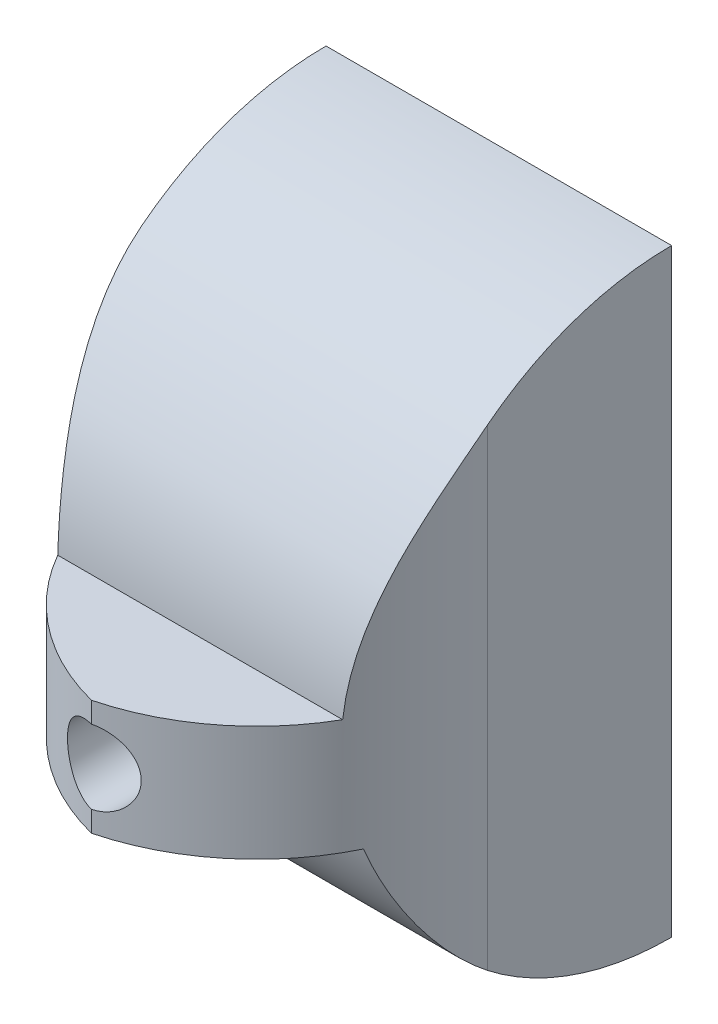
ISO-10303-21;
HEADER;
FILE_DESCRIPTION(('STEP AP214'),'2;1');
FILE_NAME('part.step','',(''),(''),'','','');
FILE_SCHEMA(('AUTOMOTIVE_DESIGN { 1 0 10303 214 1 1 1 1 }'));
ENDSEC;
DATA;
#1=APPLICATION_CONTEXT('core data for automotive mechanical design processes');
#2=APPLICATION_PROTOCOL_DEFINITION('international standard','automotive_design',2000,#1);
#3=PRODUCT_CONTEXT('',#1,'mechanical');
#4=PRODUCT('Part','Part','',(#3));
#5=PRODUCT_RELATED_PRODUCT_CATEGORY('part','',(#4));
#6=PRODUCT_DEFINITION_FORMATION('','',#4);
#7=PRODUCT_DEFINITION_CONTEXT('part definition',#1,'design');
#8=PRODUCT_DEFINITION('design','',#6,#7);
#9=PRODUCT_DEFINITION_SHAPE('','',#8);
#10=(LENGTH_UNIT() NAMED_UNIT(*) SI_UNIT(.MILLI.,.METRE.));
#11=(NAMED_UNIT(*) PLANE_ANGLE_UNIT() SI_UNIT($,.RADIAN.));
#12=(NAMED_UNIT(*) SI_UNIT($,.STERADIAN.) SOLID_ANGLE_UNIT());
#13=UNCERTAINTY_MEASURE_WITH_UNIT(LENGTH_MEASURE(1.E-05),#10,'distance_accuracy_value','');
#14=(GEOMETRIC_REPRESENTATION_CONTEXT(3) GLOBAL_UNCERTAINTY_ASSIGNED_CONTEXT((#13)) GLOBAL_UNIT_ASSIGNED_CONTEXT((#10,
#11,#12)) REPRESENTATION_CONTEXT('',''));
#15=CARTESIAN_POINT('',(0.,0.,0.));
#16=DIRECTION('',(0.,0.,1.));
#17=DIRECTION('',(1.,0.,0.));
#18=AXIS2_PLACEMENT_3D('',#15,#16,#17);
#19=CARTESIAN_POINT('',(0.,0.,18.));
#20=DIRECTION('',(1.,0.,0.));
#21=DIRECTION('',(0.,1.,0.));
#22=AXIS2_PLACEMENT_3D('',#19,#20,#21);
#23=PLANE('',#22);
#24=CARTESIAN_POINT('',(0.,13.,0.));
#25=DIRECTION('',(1.,0.,0.));
#26=DIRECTION('',(0.,1.,0.));
#27=AXIS2_PLACEMENT_3D('',#24,#25,#26);
#28=CIRCLE('',#27,13.);
#29=CARTESIAN_POINT('',(0.,0.,0.));
#30=VERTEX_POINT('',#29);
#31=CARTESIAN_POINT('',(0.,2.7530492340404,8.));
#32=VERTEX_POINT('',#31);
#33=EDGE_CURVE('E217',#30,#32,#28,.F.);
#34=ORIENTED_EDGE('',*,*,#33,.T.);
#35=DIRECTION('',(0.,-1.,0.));
#36=VECTOR('',#35,1.);
#37=CARTESIAN_POINT('',(0.,0.,8.));
#38=LINE('',#37,#36);
#39=CARTESIAN_POINT('',(0.,23.2469507659596,8.));
#40=VERTEX_POINT('',#39);
#41=EDGE_CURVE('E48',#32,#40,#38,.F.);
#42=ORIENTED_EDGE('',*,*,#41,.T.);
#43=CARTESIAN_POINT('',(0.,13.,0.));
#44=DIRECTION('',(1.,0.,0.));
#45=DIRECTION('',(0.,1.,0.));
#46=AXIS2_PLACEMENT_3D('',#43,#44,#45);
#47=CIRCLE('',#46,13.);
#48=CARTESIAN_POINT('',(0.,26.,0.));
#49=VERTEX_POINT('',#48);
#50=EDGE_CURVE('E154',#40,#49,#47,.F.);
#51=ORIENTED_EDGE('',*,*,#50,.T.);
#52=DIRECTION('',(0.,-1.,0.));
#53=VECTOR('',#52,1.);
#54=CARTESIAN_POINT('',(0.,0.,0.));
#55=LINE('',#54,#53);
#56=EDGE_CURVE('E242',#49,#30,#55,.T.);
#57=ORIENTED_EDGE('',*,*,#56,.T.);
#58=EDGE_LOOP('',(#34,#42,#51,#57));
#59=FACE_BOUND('',#58,.T.);
#60=ADVANCED_FACE('F35',(#59),#23,.F.);
#61=CARTESIAN_POINT('',(15.,0.,18.));
#62=DIRECTION('',(-1.,0.,0.));
#63=DIRECTION('',(0.,-1.,0.));
#64=AXIS2_PLACEMENT_3D('',#61,#62,#63);
#65=PLANE('',#64);
#66=CARTESIAN_POINT('',(15.,13.,0.));
#67=DIRECTION('',(1.,0.,0.));
#68=DIRECTION('',(0.,1.,0.));
#69=AXIS2_PLACEMENT_3D('',#66,#67,#68);
#70=CIRCLE('',#69,13.);
#71=CARTESIAN_POINT('',(15.,26.,0.));
#72=VERTEX_POINT('',#71);
#73=CARTESIAN_POINT('',(15.,23.2469507659596,8.));
#74=VERTEX_POINT('',#73);
#75=EDGE_CURVE('E214',#72,#74,#70,.T.);
#76=ORIENTED_EDGE('',*,*,#75,.T.);
#77=DIRECTION('',(0.,1.,0.));
#78=VECTOR('',#77,1.);
#79=CARTESIAN_POINT('',(15.,0.,8.));
#80=LINE('',#79,#78);
#81=CARTESIAN_POINT('',(15.,2.7530492340404,8.));
#82=VERTEX_POINT('',#81);
#83=EDGE_CURVE('E189',#74,#82,#80,.F.);
#84=ORIENTED_EDGE('',*,*,#83,.T.);
#85=CARTESIAN_POINT('',(15.,13.,0.));
#86=DIRECTION('',(1.,0.,0.));
#87=DIRECTION('',(0.,1.,0.));
#88=AXIS2_PLACEMENT_3D('',#85,#86,#87);
#89=CIRCLE('',#88,13.);
#90=CARTESIAN_POINT('',(15.,0.,0.));
#91=VERTEX_POINT('',#90);
#92=EDGE_CURVE('E221',#82,#91,#89,.T.);
#93=ORIENTED_EDGE('',*,*,#92,.T.);
#94=DIRECTION('',(0.,1.,0.));
#95=VECTOR('',#94,1.);
#96=CARTESIAN_POINT('',(15.,0.,0.));
#97=LINE('',#96,#95);
#98=EDGE_CURVE('E251',#91,#72,#97,.T.);
#99=ORIENTED_EDGE('',*,*,#98,.T.);
#100=EDGE_LOOP('',(#76,#84,#93,#99));
#101=FACE_BOUND('',#100,.T.);
#102=ADVANCED_FACE('F297',(#101),#65,.F.);
#103=CARTESIAN_POINT('',(0.,26.,0.));
#104=DIRECTION('',(0.,0.,-1.));
#105=DIRECTION('',(-1.,0.,0.));
#106=AXIS2_PLACEMENT_3D('',#103,#104,#105);
#107=PLANE('',#106);
#108=ORIENTED_EDGE('',*,*,#56,.F.);
#109=DIRECTION('',(-1.,0.,0.));
#110=VECTOR('',#109,1.);
#111=CARTESIAN_POINT('',(0.,26.,0.));
#112=LINE('',#111,#110);
#113=EDGE_CURVE('E254',#72,#49,#112,.T.);
#114=ORIENTED_EDGE('',*,*,#113,.F.);
#115=ORIENTED_EDGE('',*,*,#98,.F.);
#116=DIRECTION('',(1.,0.,0.));
#117=VECTOR('',#116,1.);
#118=CARTESIAN_POINT('',(0.,0.,0.));
#119=LINE('',#118,#117);
#120=EDGE_CURVE('E248',#30,#91,#119,.T.);
#121=ORIENTED_EDGE('',*,*,#120,.F.);
#122=EDGE_LOOP('',(#108,#114,#115,#121));
#123=FACE_BOUND('',#122,.T.);
#124=DIRECTION('',(1.,0.,0.));
#125=VECTOR('',#124,1.);
#126=CARTESIAN_POINT('',(3.,25.,0.));
#127=LINE('',#126,#125);
#128=CARTESIAN_POINT('',(3.,25.,0.));
#129=VERTEX_POINT('',#128);
#130=CARTESIAN_POINT('',(12.,25.,0.));
#131=VERTEX_POINT('',#130);
#132=EDGE_CURVE('E277',#129,#131,#127,.T.);
#133=ORIENTED_EDGE('',*,*,#132,.F.);
#134=DIRECTION('',(0.,-1.,0.));
#135=VECTOR('',#134,1.);
#136=CARTESIAN_POINT('',(3.,26.,0.));
#137=LINE('',#136,#135);
#138=CARTESIAN_POINT('',(3.,17.,0.));
#139=VERTEX_POINT('',#138);
#140=EDGE_CURVE('E238',#129,#139,#137,.T.);
#141=ORIENTED_EDGE('',*,*,#140,.T.);
#142=DIRECTION('',(1.,0.,0.));
#143=VECTOR('',#142,1.);
#144=CARTESIAN_POINT('',(2.,17.,0.));
#145=LINE('',#144,#143);
#146=CARTESIAN_POINT('',(2.,17.,0.));
#147=VERTEX_POINT('',#146);
#148=EDGE_CURVE('E264',#147,#139,#145,.T.);
#149=ORIENTED_EDGE('',*,*,#148,.F.);
#150=DIRECTION('',(0.,-1.,0.));
#151=VECTOR('',#150,1.);
#152=CARTESIAN_POINT('',(1.99999999999999,26.,0.));
#153=LINE('',#152,#151);
#154=CARTESIAN_POINT('',(2.,9.00000000000001,0.));
#155=VERTEX_POINT('',#154);
#156=EDGE_CURVE('E267',#147,#155,#153,.T.);
#157=ORIENTED_EDGE('',*,*,#156,.T.);
#158=DIRECTION('',(1.,0.,0.));
#159=VECTOR('',#158,1.);
#160=CARTESIAN_POINT('',(2.,9.00000000000001,0.));
#161=LINE('',#160,#159);
#162=CARTESIAN_POINT('',(3.00000000000001,9.00000000000001,0.));
#163=VERTEX_POINT('',#162);
#164=EDGE_CURVE('E259',#163,#155,#161,.F.);
#165=ORIENTED_EDGE('',*,*,#164,.F.);
#166=CARTESIAN_POINT('',(3.00000000000001,0.99999999999999,0.));
#167=VERTEX_POINT('',#166);
#168=EDGE_CURVE('E235',#163,#167,#137,.T.);
#169=ORIENTED_EDGE('',*,*,#168,.T.);
#170=DIRECTION('',(1.,0.,0.));
#171=VECTOR('',#170,1.);
#172=CARTESIAN_POINT('',(3.00000000000001,0.99999999999999,0.));
#173=LINE('',#172,#171);
#174=CARTESIAN_POINT('',(12.,0.999999999999992,0.));
#175=VERTEX_POINT('',#174);
#176=EDGE_CURVE('E275',#175,#167,#173,.F.);
#177=ORIENTED_EDGE('',*,*,#176,.F.);
#178=DIRECTION('',(0.,-1.,0.));
#179=VECTOR('',#178,1.);
#180=CARTESIAN_POINT('',(12.,26.,0.));
#181=LINE('',#180,#179);
#182=CARTESIAN_POINT('',(12.,9.00000000000001,0.));
#183=VERTEX_POINT('',#182);
#184=EDGE_CURVE('E230',#183,#175,#181,.T.);
#185=ORIENTED_EDGE('',*,*,#184,.F.);
#186=CARTESIAN_POINT('',(13.,9.00000000000001,0.));
#187=VERTEX_POINT('',#186);
#188=EDGE_CURVE('E260',#187,#183,#161,.F.);
#189=ORIENTED_EDGE('',*,*,#188,.F.);
#190=DIRECTION('',(0.,-1.,0.));
#191=VECTOR('',#190,1.);
#192=CARTESIAN_POINT('',(13.,26.,0.));
#193=LINE('',#192,#191);
#194=CARTESIAN_POINT('',(13.,17.,0.));
#195=VERTEX_POINT('',#194);
#196=EDGE_CURVE('E257',#195,#187,#193,.T.);
#197=ORIENTED_EDGE('',*,*,#196,.F.);
#198=CARTESIAN_POINT('',(12.,17.,0.));
#199=VERTEX_POINT('',#198);
#200=EDGE_CURVE('E263',#199,#195,#145,.T.);
#201=ORIENTED_EDGE('',*,*,#200,.F.);
#202=EDGE_CURVE('E234',#131,#199,#181,.T.);
#203=ORIENTED_EDGE('',*,*,#202,.F.);
#204=EDGE_LOOP('',(#133,#141,#149,#157,#165,#169,#177,#185,#189,#197,#201,#203));
#205=FACE_BOUND('',#204,.T.);
#206=ADVANCED_FACE('F293',(#123,#205),#107,.T.);
#207=CARTESIAN_POINT('',(2.,13.,0.));
#208=DIRECTION('',(1.,0.,0.));
#209=DIRECTION('',(0.,1.,0.));
#210=AXIS2_PLACEMENT_3D('',#207,#208,#209);
#211=CYLINDRICAL_SURFACE('',#210,4.);
#212=CARTESIAN_POINT('',(3.,13.,0.));
#213=DIRECTION('',(1.,0.,0.));
#214=DIRECTION('',(0.,1.,0.));
#215=AXIS2_PLACEMENT_3D('',#212,#213,#214);
#216=CIRCLE('',#215,4.);
#217=EDGE_CURVE('E273',#163,#139,#216,.F.);
#218=ORIENTED_EDGE('',*,*,#217,.F.);
#219=ORIENTED_EDGE('',*,*,#164,.T.);
#220=CARTESIAN_POINT('',(2.,13.,0.));
#221=DIRECTION('',(1.,0.,0.));
#222=DIRECTION('',(0.,1.,0.));
#223=AXIS2_PLACEMENT_3D('',#220,#221,#222);
#224=CIRCLE('',#223,4.);
#225=EDGE_CURVE('E239',#147,#155,#224,.T.);
#226=ORIENTED_EDGE('',*,*,#225,.F.);
#227=ORIENTED_EDGE('',*,*,#148,.T.);
#228=EDGE_LOOP('',(#218,#219,#226,#227));
#229=FACE_BOUND('',#228,.T.);
#230=ADVANCED_FACE('F319',(#229),#211,.F.);
#231=ORIENTED_EDGE('',*,*,#188,.T.);
#232=CARTESIAN_POINT('',(12.,13.,0.));
#233=DIRECTION('',(1.,0.,0.));
#234=DIRECTION('',(0.,1.,0.));
#235=AXIS2_PLACEMENT_3D('',#232,#233,#234);
#236=CIRCLE('',#235,4.);
#237=EDGE_CURVE('E270',#183,#199,#236,.F.);
#238=ORIENTED_EDGE('',*,*,#237,.T.);
#239=ORIENTED_EDGE('',*,*,#200,.T.);
#240=CARTESIAN_POINT('',(13.,13.,0.));
#241=DIRECTION('',(1.,0.,0.));
#242=DIRECTION('',(0.,1.,0.));
#243=AXIS2_PLACEMENT_3D('',#240,#241,#242);
#244=CIRCLE('',#243,4.);
#245=EDGE_CURVE('E243',#195,#187,#244,.T.);
#246=ORIENTED_EDGE('',*,*,#245,.T.);
#247=EDGE_LOOP('',(#231,#238,#239,#246));
#248=FACE_BOUND('',#247,.T.);
#249=ADVANCED_FACE('F322',(#248),#211,.F.);
#250=CARTESIAN_POINT('',(2.,13.,0.));
#251=DIRECTION('',(1.,0.,0.));
#252=DIRECTION('',(0.,1.,0.));
#253=AXIS2_PLACEMENT_3D('',#250,#251,#252);
#254=PLANE('',#253);
#255=ORIENTED_EDGE('',*,*,#225,.T.);
#256=ORIENTED_EDGE('',*,*,#156,.F.);
#257=EDGE_LOOP('',(#255,#256));
#258=FACE_BOUND('',#257,.T.);
#259=ADVANCED_FACE('F325',(#258),#254,.T.);
#260=CARTESIAN_POINT('',(13.,13.,0.));
#261=DIRECTION('',(1.,0.,0.));
#262=DIRECTION('',(0.,1.,0.));
#263=AXIS2_PLACEMENT_3D('',#260,#261,#262);
#264=PLANE('',#263);
#265=ORIENTED_EDGE('',*,*,#196,.T.);
#266=ORIENTED_EDGE('',*,*,#245,.F.);
#267=EDGE_LOOP('',(#265,#266));
#268=FACE_BOUND('',#267,.T.);
#269=ADVANCED_FACE('F327',(#268),#264,.F.);
#270=CARTESIAN_POINT('',(3.,13.,0.));
#271=DIRECTION('',(1.,0.,0.));
#272=DIRECTION('',(0.,1.,0.));
#273=AXIS2_PLACEMENT_3D('',#270,#271,#272);
#274=CYLINDRICAL_SURFACE('',#273,12.);
#275=ORIENTED_EDGE('',*,*,#132,.T.);
#276=CARTESIAN_POINT('',(12.,13.,0.));
#277=DIRECTION('',(1.,0.,0.));
#278=DIRECTION('',(0.,1.,0.));
#279=AXIS2_PLACEMENT_3D('',#276,#277,#278);
#280=CIRCLE('',#279,12.);
#281=EDGE_CURVE('E226',#131,#175,#280,.T.);
#282=ORIENTED_EDGE('',*,*,#281,.T.);
#283=ORIENTED_EDGE('',*,*,#176,.T.);
#284=CARTESIAN_POINT('',(3.,13.,0.));
#285=DIRECTION('',(1.,0.,0.));
#286=DIRECTION('',(0.,1.,0.));
#287=AXIS2_PLACEMENT_3D('',#284,#285,#286);
#288=CIRCLE('',#287,12.);
#289=EDGE_CURVE('E227',#129,#167,#288,.T.);
#290=ORIENTED_EDGE('',*,*,#289,.F.);
#291=EDGE_LOOP('',(#275,#282,#283,#290));
#292=FACE_BOUND('',#291,.T.);
#293=ADVANCED_FACE('F330',(#292),#274,.F.);
#294=CARTESIAN_POINT('',(3.,13.,0.));
#295=DIRECTION('',(1.,0.,0.));
#296=DIRECTION('',(0.,1.,0.));
#297=AXIS2_PLACEMENT_3D('',#294,#295,#296);
#298=PLANE('',#297);
#299=ORIENTED_EDGE('',*,*,#289,.T.);
#300=ORIENTED_EDGE('',*,*,#168,.F.);
#301=ORIENTED_EDGE('',*,*,#217,.T.);
#302=ORIENTED_EDGE('',*,*,#140,.F.);
#303=EDGE_LOOP('',(#299,#300,#301,#302));
#304=FACE_BOUND('',#303,.T.);
#305=ADVANCED_FACE('F308',(#304),#298,.T.);
#306=CARTESIAN_POINT('',(12.,13.,0.));
#307=DIRECTION('',(1.,0.,0.));
#308=DIRECTION('',(0.,1.,0.));
#309=AXIS2_PLACEMENT_3D('',#306,#307,#308);
#310=PLANE('',#309);
#311=ORIENTED_EDGE('',*,*,#202,.T.);
#312=ORIENTED_EDGE('',*,*,#237,.F.);
#313=ORIENTED_EDGE('',*,*,#184,.T.);
#314=ORIENTED_EDGE('',*,*,#281,.F.);
#315=EDGE_LOOP('',(#311,#312,#313,#314));
#316=FACE_BOUND('',#315,.T.);
#317=ADVANCED_FACE('F303',(#316),#310,.F.);
#318=CARTESIAN_POINT('',(-0.0010000000000062,8.99999999999999,20.4237805730259));
#319=DIRECTION('',(0.,-1.,0.));
#320=DIRECTION('',(0.,0.,-1.));
#321=AXIS2_PLACEMENT_3D('',#318,#319,#320);
#322=PLANE('',#321);
#323=DIRECTION('',(1.,0.,0.));
#324=VECTOR('',#323,1.);
#325=CARTESIAN_POINT('',(-0.0010000000000062,8.99999999999999,12.369316876853));
#326=LINE('',#325,#324);
#327=CARTESIAN_POINT('',(1.00505308355587,8.99999999999999,12.369316876853));
#328=VERTEX_POINT('',#327);
#329=CARTESIAN_POINT('',(13.9949469164441,9.,12.369316876853));
#330=VERTEX_POINT('',#329);
#331=EDGE_CURVE('E223',#328,#330,#326,.T.);
#332=ORIENTED_EDGE('',*,*,#331,.T.);
#333=CARTESIAN_POINT('',(5.,8.99999999999999,8.));
#334=DIRECTION('',(0.,-1.,0.));
#335=DIRECTION('',(0.,0.,-1.));
#336=AXIS2_PLACEMENT_3D('',#333,#334,#335);
#337=CIRCLE('',#336,10.);
#338=CARTESIAN_POINT('',(7.5,8.99999999999999,17.6824583655185));
#339=VERTEX_POINT('',#338);
#340=EDGE_CURVE('E158',#330,#339,#337,.T.);
#341=ORIENTED_EDGE('',*,*,#340,.T.);
#342=CARTESIAN_POINT('',(10.,8.99999999999999,8.));
#343=DIRECTION('',(0.,-1.,0.));
#344=DIRECTION('',(0.,0.,-1.));
#345=AXIS2_PLACEMENT_3D('',#342,#343,#344);
#346=CIRCLE('',#345,10.);
#347=EDGE_CURVE('E160',#339,#328,#346,.T.);
#348=ORIENTED_EDGE('',*,*,#347,.T.);
#349=EDGE_LOOP('',(#332,#341,#348));
#350=FACE_BOUND('',#349,.T.);
#351=ADVANCED_FACE('F301',(#350),#322,.T.);
#352=CARTESIAN_POINT('',(-0.0010000000000062,13.,0.));
#353=DIRECTION('',(1.,0.,0.));
#354=DIRECTION('',(0.,1.,0.));
#355=AXIS2_PLACEMENT_3D('',#352,#353,#354);
#356=CYLINDRICAL_SURFACE('',#355,13.);
#357=ORIENTED_EDGE('',*,*,#92,.F.);
#358=CARTESIAN_POINT('',(15.,2.7530492340404,8.));
#359=CARTESIAN_POINT('',(14.9999998318679,2.85828723149101,8.13479993786347));
#360=CARTESIAN_POINT('',(14.9972742956143,2.96616517687922,8.26748896937473));
#361=CARTESIAN_POINT('',(14.9868845549506,3.18694471827831,8.52837222233529));
#362=CARTESIAN_POINT('',(14.9792214536348,3.29984518697115,8.65656744099738));
#363=CARTESIAN_POINT('',(14.9496234550719,3.64539620536485,9.03368569991535));
#364=CARTESIAN_POINT('',(14.9210765385485,3.88523761596185,9.27557804508672));
#365=CARTESIAN_POINT('',(14.8512742905671,4.37617701712372,9.73343685309302));
#366=CARTESIAN_POINT('',(14.8103305975065,4.62688246675125,9.94987610405439));
#367=CARTESIAN_POINT('',(14.7192557453131,5.14309462914276,10.3623457471823));
#368=CARTESIAN_POINT('',(14.6691216898553,5.4086059895551,10.5583696748736));
#369=CARTESIAN_POINT('',(14.5670602752685,5.93366616058265,10.9160699048367));
#370=CARTESIAN_POINT('',(14.5155115174019,6.19230502783117,11.0791956668982));
#371=CARTESIAN_POINT('',(14.4104717819067,6.7200751559036,11.3866496888696));
#372=CARTESIAN_POINT('',(14.356981165263,6.98920446726928,11.5309814198735));
#373=CARTESIAN_POINT('',(14.2496439805217,7.54320911896365,11.8034246845647));
#374=CARTESIAN_POINT('',(14.1958161322626,7.8283018656222,11.9311020948955));
#375=CARTESIAN_POINT('',(14.0918748630102,8.40759454953236,12.165833004497));
#376=CARTESIAN_POINT('',(14.0417624237492,8.70179686492294,12.272881064686));
#377=CARTESIAN_POINT('',(13.9949469164441,9.,12.369316876853));
#378=B_SPLINE_CURVE_WITH_KNOTS('',3,(#358,#359,#360,#361,#362,#363,#364,#365,#366,#367,#368,
#369,#370,#371,#372,#373,#374,#375,#376,#377),.UNSPECIFIED.,.F.,.F.,(4,2,2,2,2,2,2,2,2,4),(0.,
0.512920092193258,1.02572563337552,2.04968092743253,3.04977554723917,4.05018588848339,
4.97972990289488,5.90910199437499,6.85922525802486,7.80959868703848),.UNSPECIFIED.);
#379=EDGE_CURVE('E162',#82,#330,#378,.T.);
#380=ORIENTED_EDGE('',*,*,#379,.T.);
#381=ORIENTED_EDGE('',*,*,#331,.F.);
#382=CARTESIAN_POINT('',(1.00505308355587,8.99999999999999,12.369316876853));
#383=CARTESIAN_POINT('',(0.973002361048377,8.79592835208449,12.3033207883699));
#384=CARTESIAN_POINT('',(0.939425434955882,8.59375056735331,12.2323648268533));
#385=CARTESIAN_POINT('',(0.87010948323206,8.1934825391262,12.080695987496));
#386=CARTESIAN_POINT('',(0.834370623114919,7.99539198427179,11.9999838561009));
#387=CARTESIAN_POINT('',(0.725187130790062,7.4073772446962,11.743320139932));
#388=CARTESIAN_POINT('',(0.649823437077635,7.02399948248389,11.5529350298241));
#389=CARTESIAN_POINT('',(0.50386673674617,6.28904879662145,11.1415891352395));
#390=CARTESIAN_POINT('',(0.43319828412515,5.93685985214206,10.9217513051389));
#391=CARTESIAN_POINT('',(0.301324839021137,5.25418373694802,10.4486677391429));
#392=CARTESIAN_POINT('',(0.240111938623224,4.92367856610938,10.1954502516291));
#393=CARTESIAN_POINT('',(0.131441282435276,4.26903170760612,9.64177554700368));
#394=CARTESIAN_POINT('',(0.0849411084587857,3.94627302073336,9.33947128857278));
#395=CARTESIAN_POINT('',(0.0356184164567385,3.48309815169858,8.85885151051845));
#396=CARTESIAN_POINT('',(0.0225617936330998,3.33105078690566,8.69265030317337));
#397=CARTESIAN_POINT('',(0.00474990948351053,3.03548507121658,8.35220481090887));
#398=CARTESIAN_POINT('',(6.00176656597688E-07,2.89197290667259,8.17795485089523));
#399=CARTESIAN_POINT('',(0.,2.75304923404039,8.));
#400=B_SPLINE_CURVE_WITH_KNOTS('',3,(#382,#383,#384,#385,#386,#387,#388,#389,#390,#391,#392,
#393,#394,#395,#396,#397,#398,#399),.UNSPECIFIED.,.F.,.F.,(4,2,2,2,2,2,2,2,4),(0.,
0.650420596201151,1.30079146011525,2.60245330152732,3.86400498458459,5.12449582048059,
6.45528835471777,7.13179309696133,7.80878234268855),.UNSPECIFIED.);
#401=EDGE_CURVE('E168',#328,#32,#400,.T.);
#402=ORIENTED_EDGE('',*,*,#401,.T.);
#403=ORIENTED_EDGE('',*,*,#33,.F.);
#404=ORIENTED_EDGE('',*,*,#120,.T.);
#405=EDGE_LOOP('',(#357,#380,#381,#402,#403,#404));
#406=FACE_BOUND('',#405,.T.);
#407=ADVANCED_FACE('F173',(#406),#356,.T.);
#408=CARTESIAN_POINT('',(-0.00100000000000794,14.,20.4237805730259));
#409=DIRECTION('',(0.,1.,0.));
#410=DIRECTION('',(-1.,0.,0.));
#411=AXIS2_PLACEMENT_3D('',#408,#409,#410);
#412=PLANE('',#411);
#413=CARTESIAN_POINT('',(10.,14.,8.));
#414=DIRECTION('',(0.,1.,0.));
#415=DIRECTION('',(-1.,0.,0.));
#416=AXIS2_PLACEMENT_3D('',#413,#414,#415);
#417=CIRCLE('',#416,10.);
#418=CARTESIAN_POINT('',(1.31762115840068,14.,12.9614813968157));
#419=VERTEX_POINT('',#418);
#420=CARTESIAN_POINT('',(7.5,14.,17.6824583655185));
#421=VERTEX_POINT('',#420);
#422=EDGE_CURVE('E279',#419,#421,#417,.T.);
#423=ORIENTED_EDGE('',*,*,#422,.T.);
#424=CARTESIAN_POINT('',(5.,14.,8.));
#425=DIRECTION('',(0.,1.,0.));
#426=DIRECTION('',(-1.,0.,0.));
#427=AXIS2_PLACEMENT_3D('',#424,#425,#426);
#428=CIRCLE('',#427,10.);
#429=CARTESIAN_POINT('',(13.6823788415993,14.,12.9614813968157));
#430=VERTEX_POINT('',#429);
#431=EDGE_CURVE('E151',#421,#430,#428,.T.);
#432=ORIENTED_EDGE('',*,*,#431,.T.);
#433=DIRECTION('',(1.,0.,0.));
#434=VECTOR('',#433,1.);
#435=CARTESIAN_POINT('',(-0.00100000000000794,14.,12.9614813968157));
#436=LINE('',#435,#434);
#437=EDGE_CURVE('E152',#419,#430,#436,.T.);
#438=ORIENTED_EDGE('',*,*,#437,.F.);
#439=EDGE_LOOP('',(#423,#432,#438));
#440=FACE_BOUND('',#439,.T.);
#441=ADVANCED_FACE('F199',(#440),#412,.T.);
#442=CARTESIAN_POINT('',(-0.0010000000000062,13.,0.));
#443=DIRECTION('',(1.,0.,0.));
#444=DIRECTION('',(0.,1.,0.));
#445=AXIS2_PLACEMENT_3D('',#442,#443,#444);
#446=CYLINDRICAL_SURFACE('',#445,13.);
#447=ORIENTED_EDGE('',*,*,#437,.T.);
#448=CARTESIAN_POINT('',(13.6823788415993,14.,12.9614813968157));
#449=CARTESIAN_POINT('',(13.6900905623616,14.1752068344678,12.9479675450902));
#450=CARTESIAN_POINT('',(13.69981151966,14.3500428244198,12.930901438186));
#451=CARTESIAN_POINT('',(13.7230166082792,14.6986148026126,12.8897431447739));
#452=CARTESIAN_POINT('',(13.736500295611,14.8723509181628,12.8656517872058));
#453=CARTESIAN_POINT('',(13.7669630984261,15.2182429796318,12.8105442235337));
#454=CARTESIAN_POINT('',(13.7839389020766,15.3904002624555,12.779534576218));
#455=CARTESIAN_POINT('',(13.8210570837171,15.7329884834108,12.7106770305787));
#456=CARTESIAN_POINT('',(13.8411995487642,15.9034193739437,12.67282894425));
#457=CARTESIAN_POINT('',(13.9058297331577,16.4117533591514,12.5491644435014));
#458=CARTESIAN_POINT('',(13.9545223075862,16.7467202400656,12.4532241937541));
#459=CARTESIAN_POINT('',(14.0596555478471,17.4067928187698,12.2352392018779));
#460=CARTESIAN_POINT('',(14.1160979601121,17.7318962736086,12.1131885722828));
#461=CARTESIAN_POINT('',(14.2327623418771,18.3698690440022,11.8441555707686));
#462=CARTESIAN_POINT('',(14.2929739048917,18.6827684822755,11.6972400892688));
#463=CARTESIAN_POINT('',(14.4133677824139,19.2958969401111,11.3789722234233));
#464=CARTESIAN_POINT('',(14.473550095687,19.59612546424,11.2076188847012));
#465=CARTESIAN_POINT('',(14.5897011229117,20.1819048509477,10.8415507461292));
#466=CARTESIAN_POINT('',(14.6456790832032,20.4674874563287,10.6468898082008));
#467=CARTESIAN_POINT('',(14.7494175804667,21.023086988942,10.2347313772869));
#468=CARTESIAN_POINT('',(14.7971809715352,21.2931093007229,10.0172418584019));
#469=CARTESIAN_POINT('',(14.8876345359774,21.8624434875272,9.51966501901375));
#470=CARTESIAN_POINT('',(14.9279261893417,22.1584674707606,9.23531436134754));
#471=CARTESIAN_POINT('',(14.9700634338823,22.582266465978,8.78763701158643));
#472=CARTESIAN_POINT('',(14.9810608743656,22.7202821373608,8.63472975314419));
#473=CARTESIAN_POINT('',(14.996030871227,22.9891299217749,8.32224746313369));
#474=CARTESIAN_POINT('',(14.9999993525289,23.1199578251029,8.16266861851358));
#475=CARTESIAN_POINT('',(15.,23.2469507659596,8.));
#476=B_SPLINE_CURVE_WITH_KNOTS('',3,(#448,#449,#450,#451,#452,#453,#454,#455,#456,#457,#458,
#459,#460,#461,#462,#463,#464,#465,#466,#467,#468,#469,#470,#471,#472,#473,#474,#475),
.UNSPECIFIED.,.F.,.F.,(4,2,2,2,2,2,2,2,2,2,2,2,2,4),(0.,0.527628606009798,1.05519497999972,
1.58226331144617,2.1093461354757,3.1634434608178,4.21777871896422,5.26932146427548,
6.32090528694642,7.37010426055736,8.41893795739465,9.65361463987039,10.2721361197369,
10.8910160734615),.UNSPECIFIED.);
#477=EDGE_CURVE('E184',#430,#74,#476,.T.);
#478=ORIENTED_EDGE('',*,*,#477,.T.);
#479=ORIENTED_EDGE('',*,*,#75,.F.);
#480=ORIENTED_EDGE('',*,*,#113,.T.);
#481=ORIENTED_EDGE('',*,*,#50,.F.);
#482=CARTESIAN_POINT('',(0.,23.2469507659596,8.));
#483=CARTESIAN_POINT('',(1.33167464551656E-07,23.1428165480481,8.1333860704202));
#484=CARTESIAN_POINT('',(0.00266882241140156,23.0360969633565,8.26470595243553));
#485=CARTESIAN_POINT('',(0.0128471338023797,22.8177364522254,8.52294721026941));
#486=CARTESIAN_POINT('',(0.0203556733889249,22.7060966315279,8.64986956302339));
#487=CARTESIAN_POINT('',(0.0493686528341113,22.3644574650362,9.02333769700145));
#488=CARTESIAN_POINT('',(0.0773635894210649,22.1274096841721,9.26300524668937));
#489=CARTESIAN_POINT('',(0.146603809955229,21.6371766070681,9.7217116105914));
#490=CARTESIAN_POINT('',(0.187816648741614,21.3840320300172,9.94079925592487));
#491=CARTESIAN_POINT('',(0.279667862214981,20.8626062111499,10.3581353434221));
#492=CARTESIAN_POINT('',(0.330309480187615,20.5943197830767,10.5563765780674));
#493=CARTESIAN_POINT('',(0.437009887206618,20.0453952796685,10.9303343158603));
#494=CARTESIAN_POINT('',(0.49304265259523,19.7648197822227,11.1061503544257));
#495=CARTESIAN_POINT('',(0.607119062856348,19.1914113655528,11.4357234462568));
#496=CARTESIAN_POINT('',(0.665162631190339,18.8985789127851,11.5894813379935));
#497=CARTESIAN_POINT('',(0.779710488171692,18.3020180171381,11.8742487246654));
#498=CARTESIAN_POINT('',(0.836215798978625,17.9982971366405,12.0052736527394));
#499=CARTESIAN_POINT('',(0.944317316748453,17.3810006097789,12.2440309517267));
#500=CARTESIAN_POINT('',(0.995914387430412,17.0674267102509,12.3517674250468));
#501=CARTESIAN_POINT('',(1.0767239541516,16.5272110508231,12.5145024012277));
#502=CARTESIAN_POINT('',(1.1080085310056,16.3027060485267,12.5756266300796));
#503=CARTESIAN_POINT('',(1.16559649102923,15.8501693437586,12.6858484735764));
#504=CARTESIAN_POINT('',(1.1919010061781,15.622138455506,12.7349488220229));
#505=CARTESIAN_POINT('',(1.23865628470314,15.1629868591811,12.8209228266045));
#506=CARTESIAN_POINT('',(1.25910223387544,14.931863772424,12.8577864312662));
#507=CARTESIAN_POINT('',(1.29344686247589,14.4673858515477,12.9190462305836));
#508=CARTESIAN_POINT('',(1.30734258699082,14.2340300585573,12.9434367988692));
#509=CARTESIAN_POINT('',(1.31762115840068,14.,12.9614813968157));
#510=B_SPLINE_CURVE_WITH_KNOTS('',3,(#482,#483,#484,#485,#486,#487,#488,#489,#490,#491,#492,
#493,#494,#495,#496,#497,#498,#499,#500,#501,#502,#503,#504,#505,#506,#507,#508,#509),
.UNSPECIFIED.,.F.,.F.,(4,2,2,2,2,2,2,2,2,2,2,2,2,4),(0.,0.50754364860259,1.01497381102472,
2.02823894412129,3.03903567327948,4.0501807380466,5.05666884777543,6.06311868888808,
7.06888256664473,8.07446912816042,8.77843190517247,9.48223447724253,10.186613742562,
10.8913104614841),.UNSPECIFIED.);
#511=EDGE_CURVE('E190',#40,#419,#510,.T.);
#512=ORIENTED_EDGE('',*,*,#511,.T.);
#513=EDGE_LOOP('',(#447,#478,#479,#480,#481,#512));
#514=FACE_BOUND('',#513,.T.);
#515=ADVANCED_FACE('F195',(#514),#446,.T.);
#516=CARTESIAN_POINT('',(9.99999999999999,26.,8.));
#517=DIRECTION('',(0.,-1.,0.));
#518=DIRECTION('',(1.,0.,0.));
#519=AXIS2_PLACEMENT_3D('',#516,#517,#518);
#520=CYLINDRICAL_SURFACE('',#519,10.);
#521=CARTESIAN_POINT('',(7.5,13.1,17.6824583655185));
#522=CARTESIAN_POINT('',(7.45299685476135,13.0999992162612,17.6703242770906));
#523=CARTESIAN_POINT('',(7.40610913314091,13.0979278513698,17.6578503394292));
#524=CARTESIAN_POINT('',(7.31286253628651,13.089708118545,17.6323217638563));
#525=CARTESIAN_POINT('',(7.26650354743267,13.0835606439862,17.6192672537755));
#526=CARTESIAN_POINT('',(7.12881231598685,13.0591302295424,17.5794242107158));
#527=CARTESIAN_POINT('',(7.03868287464008,13.0348587764628,17.5519087654906));
#528=CARTESIAN_POINT('',(6.86428793172001,12.9712228823771,17.4960894231711));
#529=CARTESIAN_POINT('',(6.78002037749911,12.9318637563499,17.4677858069804));
#530=CARTESIAN_POINT('',(6.61940163699972,12.8390837555626,17.4116307693739));
#531=CARTESIAN_POINT('',(6.54305230908083,12.7856595901866,17.3837794553983));
#532=CARTESIAN_POINT('',(6.39953793432547,12.6652721322111,17.3296640687005));
#533=CARTESIAN_POINT('',(6.33249112493005,12.5981573756532,17.3034224466038));
#534=CARTESIAN_POINT('',(6.21079282300346,12.4523416471118,17.2545242532636));
#535=CARTESIAN_POINT('',(6.15613902752297,12.3736428322421,17.2318670161835));
#536=CARTESIAN_POINT('',(6.06334844615319,12.2102658877738,17.1926717453717));
#537=CARTESIAN_POINT('',(6.02460762178449,12.1259848660256,17.1759142932187));
#538=CARTESIAN_POINT('',(5.9621103629891,11.9511091495093,17.1485860105242));
#539=CARTESIAN_POINT('',(5.93834319474474,11.8605190292511,17.1380107486923));
#540=CARTESIAN_POINT('',(5.90824598106036,11.683592629132,17.1245710539642));
#541=CARTESIAN_POINT('',(5.90065091735321,11.5975127496472,17.121147655036));
#542=CARTESIAN_POINT('',(5.89943000064678,11.4252440451909,17.1205991669965));
#543=CARTESIAN_POINT('',(5.90580042364898,11.3390552553863,17.1234723988428));
#544=CARTESIAN_POINT('',(5.93160991901048,11.1730504848534,17.135008681841));
#545=CARTESIAN_POINT('',(5.95045251406079,11.0931218115653,17.1434073733056));
#546=CARTESIAN_POINT('',(5.99984786550749,10.9376866563845,17.1651244091768));
#547=CARTESIAN_POINT('',(6.03040209838653,10.8621807334507,17.1784433738731));
#548=CARTESIAN_POINT('',(6.10335605468542,10.7149120171649,17.2096571373356));
#549=CARTESIAN_POINT('',(6.14611672581732,10.6433579324843,17.2276896827917));
#550=CARTESIAN_POINT('',(6.24166754669195,10.5083106589092,17.2670169036666));
#551=CARTESIAN_POINT('',(6.29446044227707,10.4448196848618,17.2883124718723));
#552=CARTESIAN_POINT('',(6.41312331536241,10.3224985433922,17.3348098931699));
#553=CARTESIAN_POINT('',(6.47968926024062,10.2644096908026,17.3601865248727));
#554=CARTESIAN_POINT('',(6.62116028738174,10.1600850063088,17.4121794164467));
#555=CARTESIAN_POINT('',(6.69607101863499,10.1138572745652,17.4387965088686));
#556=CARTESIAN_POINT('',(6.8571720481131,10.0318612185738,17.4936980338738));
#557=CARTESIAN_POINT('',(6.94377083614748,9.99689684428911,17.5219857262372));
#558=CARTESIAN_POINT('',(7.12199747487949,9.94251314319976,17.5773570471961));
#559=CARTESIAN_POINT('',(7.21361709006242,9.92306912888489,17.6044425230175));
#560=CARTESIAN_POINT('',(7.33848038040496,9.90784438718806,17.6393690426354));
#561=CARTESIAN_POINT('',(7.37068388540683,9.90490527884606,17.6482029273747));
#562=CARTESIAN_POINT('',(7.43523958506293,9.90098540696044,17.6655633811499));
#563=CARTESIAN_POINT('',(7.46759147977027,9.90000167719513,17.6740903963677));
#564=CARTESIAN_POINT('',(7.49999999999999,9.89999999999998,17.6824583655185));
#565=B_SPLINE_CURVE_WITH_KNOTS('',3,(#521,#522,#523,#524,#525,#526,#527,#528,#529,#530,#531,
#532,#533,#534,#535,#536,#537,#538,#539,#540,#541,#542,#543,#544,#545,#546,#547,#548,#549,#550,
#551,#552,#553,#554,#555,#556,#557,#558,#559,#560,#561,#562,#563,#564),.UNSPECIFIED.,.F.,.F.,(4,
2,2,2,2,2,2,2,2,2,2,2,2,2,2,2,2,2,2,2,2,4),(0.,0.145535849412452,0.291039811785081,
0.58148814858362,0.871834262180089,1.16224836477034,1.45606904326694,1.74983507729475,
2.03109664866164,2.31215636846864,2.57027323654932,2.82832128426364,3.07484253110934,
3.32139486704157,3.57616680000366,3.83100856531497,4.10557876273242,4.38033597269492,
4.67174937065595,4.962698302049,5.06322065945126,5.16359041221162),.UNSPECIFIED.);
#566=CARTESIAN_POINT('',(7.5,13.1,17.6824583655185));
#567=VERTEX_POINT('',#566);
#568=CARTESIAN_POINT('',(7.5,9.89999999999999,17.6824583655185));
#569=VERTEX_POINT('',#568);
#570=EDGE_CURVE('E53',#567,#569,#565,.T.);
#571=ORIENTED_EDGE('',*,*,#570,.F.);
#572=DIRECTION('',(0.,-1.,0.));
#573=VECTOR('',#572,1.);
#574=CARTESIAN_POINT('',(7.5,13.,17.6824583655185));
#575=LINE('',#574,#573);
#576=EDGE_CURVE('E144',#421,#567,#575,.T.);
#577=ORIENTED_EDGE('',*,*,#576,.F.);
#578=ORIENTED_EDGE('',*,*,#422,.F.);
#579=ORIENTED_EDGE('',*,*,#511,.F.);
#580=ORIENTED_EDGE('',*,*,#41,.F.);
#581=ORIENTED_EDGE('',*,*,#401,.F.);
#582=ORIENTED_EDGE('',*,*,#347,.F.);
#583=EDGE_CURVE('E60',#569,#339,#575,.T.);
#584=ORIENTED_EDGE('',*,*,#583,.F.);
#585=EDGE_LOOP('',(#571,#577,#578,#579,#580,#581,#582,#584));
#586=FACE_BOUND('',#585,.T.);
#587=ADVANCED_FACE('F37',(#586),#520,.T.);
#588=CARTESIAN_POINT('',(4.99999999999999,26.,8.));
#589=DIRECTION('',(0.,1.,0.));
#590=DIRECTION('',(-1.,0.,0.));
#591=AXIS2_PLACEMENT_3D('',#588,#589,#590);
#592=CYLINDRICAL_SURFACE('',#591,10.);
#593=CARTESIAN_POINT('',(7.5,9.89999999999999,17.6824583655185));
#594=CARTESIAN_POINT('',(7.54700314523864,9.90000078373876,17.6703242770906));
#595=CARTESIAN_POINT('',(7.59389086685908,9.90207214863017,17.6578503394292));
#596=CARTESIAN_POINT('',(7.68713746371348,9.910291881455,17.6323217638563));
#597=CARTESIAN_POINT('',(7.73349645256732,9.91643935601383,17.6192672537755));
#598=CARTESIAN_POINT('',(7.87118768401315,9.94086977045763,17.5794242107158));
#599=CARTESIAN_POINT('',(7.96131712535991,9.96514122353723,17.5519087654906));
#600=CARTESIAN_POINT('',(8.13571206827999,10.0287771176229,17.4960894231711));
#601=CARTESIAN_POINT('',(8.21997962250088,10.0681362436501,17.4677858069804));
#602=CARTESIAN_POINT('',(8.38059836300027,10.1609162444374,17.4116307693739));
#603=CARTESIAN_POINT('',(8.45694769091916,10.2143404098134,17.3837794553983));
#604=CARTESIAN_POINT('',(8.60046206567452,10.3347278677889,17.3296640687005));
#605=CARTESIAN_POINT('',(8.66750887506994,10.4018426243467,17.3034224466038));
#606=CARTESIAN_POINT('',(8.78920717699653,10.5476583528882,17.2545242532636));
#607=CARTESIAN_POINT('',(8.84386097247702,10.6263571677579,17.2318670161835));
#608=CARTESIAN_POINT('',(8.93665155384681,10.7897341122262,17.1926717453717));
#609=CARTESIAN_POINT('',(8.9753923782155,10.8740151339744,17.1759142932187));
#610=CARTESIAN_POINT('',(9.0378896370109,11.0488908504907,17.1485860105242));
#611=CARTESIAN_POINT('',(9.06165680525525,11.1394809707489,17.1380107486924));
#612=CARTESIAN_POINT('',(9.09175401893964,11.3164073708679,17.1245710539642));
#613=CARTESIAN_POINT('',(9.09934908264678,11.4024872503528,17.121147655036));
#614=CARTESIAN_POINT('',(9.10056999935321,11.5747559548091,17.1205991669965));
#615=CARTESIAN_POINT('',(9.09419957635101,11.6609447446137,17.1234723988428));
#616=CARTESIAN_POINT('',(9.06839008098952,11.8269495151466,17.135008681841));
#617=CARTESIAN_POINT('',(9.04954748593921,11.9068781884347,17.1434073733056));
#618=CARTESIAN_POINT('',(9.0001521344925,12.0623133436155,17.1651244091768));
#619=CARTESIAN_POINT('',(8.96959790161346,12.1378192665493,17.1784433738731));
#620=CARTESIAN_POINT('',(8.89664394531458,12.2850879828351,17.2096571373356));
#621=CARTESIAN_POINT('',(8.85388327418267,12.3566420675157,17.2276896827917));
#622=CARTESIAN_POINT('',(8.75833245330804,12.4916893410908,17.2670169036666));
#623=CARTESIAN_POINT('',(8.70553955772292,12.5551803151381,17.2883124718723));
#624=CARTESIAN_POINT('',(8.58687668463758,12.6775014566078,17.3348098931699));
#625=CARTESIAN_POINT('',(8.52031073975938,12.7355903091974,17.3601865248727));
#626=CARTESIAN_POINT('',(8.37883971261826,12.8399149936912,17.4121794164467));
#627=CARTESIAN_POINT('',(8.30392898136501,12.8861427254348,17.4387965088686));
#628=CARTESIAN_POINT('',(8.14282795188689,12.9681387814262,17.4936980338738));
#629=CARTESIAN_POINT('',(8.05622916385252,13.0031031557109,17.5219857262372));
#630=CARTESIAN_POINT('',(7.8780025251205,13.0574868568002,17.5773570471961));
#631=CARTESIAN_POINT('',(7.78638290993758,13.0769308711151,17.6044425230175));
#632=CARTESIAN_POINT('',(7.66151961959503,13.0921556128119,17.6393690426354));
#633=CARTESIAN_POINT('',(7.62931611459316,13.0950947211539,17.6482029273747));
#634=CARTESIAN_POINT('',(7.56476041493706,13.0990145930395,17.6655633811499));
#635=CARTESIAN_POINT('',(7.53240852022973,13.0999983228049,17.6740903963677));
#636=CARTESIAN_POINT('',(7.5,13.1,17.6824583655185));
#637=B_SPLINE_CURVE_WITH_KNOTS('',3,(#593,#594,#595,#596,#597,#598,#599,#600,#601,#602,#603,
#604,#605,#606,#607,#608,#609,#610,#611,#612,#613,#614,#615,#616,#617,#618,#619,#620,#621,#622,
#623,#624,#625,#626,#627,#628,#629,#630,#631,#632,#633,#634,#635,#636),.UNSPECIFIED.,.F.,.F.,(4,
2,2,2,2,2,2,2,2,2,2,2,2,2,2,2,2,2,2,2,2,4),(0.,0.145535849412452,0.291039811785083,
0.58148814858362,0.871834262180088,1.16224836477033,1.45606904326694,1.74983507729475,
2.03109664866164,2.31215636846864,2.57027323654932,2.82832128426364,3.07484253110934,
3.32139486704157,3.57616680000366,3.83100856531497,4.10557876273242,4.38033597269492,
4.67174937065594,4.962698302049,5.06322065945126,5.16359041221162),.UNSPECIFIED.);
#638=EDGE_CURVE('E11',#569,#567,#637,.T.);
#639=ORIENTED_EDGE('',*,*,#638,.F.);
#640=ORIENTED_EDGE('',*,*,#583,.T.);
#641=ORIENTED_EDGE('',*,*,#340,.F.);
#642=ORIENTED_EDGE('',*,*,#379,.F.);
#643=ORIENTED_EDGE('',*,*,#83,.F.);
#644=ORIENTED_EDGE('',*,*,#477,.F.);
#645=ORIENTED_EDGE('',*,*,#431,.F.);
#646=ORIENTED_EDGE('',*,*,#576,.T.);
#647=EDGE_LOOP('',(#639,#640,#641,#642,#643,#644,#645,#646));
#648=FACE_BOUND('',#647,.T.);
#649=ADVANCED_FACE('F149',(#648),#592,.T.);
#650=CARTESIAN_POINT('',(7.5,11.5,13.));
#651=DIRECTION('',(0.,0.,1.));
#652=DIRECTION('',(1.,0.,0.));
#653=AXIS2_PLACEMENT_3D('',#650,#651,#652);
#654=CYLINDRICAL_SURFACE('',#653,1.6);
#655=ORIENTED_EDGE('',*,*,#570,.T.);
#656=ORIENTED_EDGE('',*,*,#638,.T.);
#657=EDGE_LOOP('',(#655,#656));
#658=FACE_BOUND('',#657,.T.);
#659=CARTESIAN_POINT('',(7.5,11.5,13.));
#660=DIRECTION('',(0.,0.,1.));
#661=DIRECTION('',(1.,0.,0.));
#662=AXIS2_PLACEMENT_3D('',#659,#660,#661);
#663=CIRCLE('',#662,1.6);
#664=CARTESIAN_POINT('',(9.1,11.5,13.));
#665=VERTEX_POINT('',#664);
#666=EDGE_CURVE('E147',#665,#665,#663,.T.);
#667=ORIENTED_EDGE('',*,*,#666,.F.);
#668=EDGE_LOOP('',(#667));
#669=FACE_BOUND('',#668,.T.);
#670=ADVANCED_FACE('F138',(#658,#669),#654,.F.);
#671=CARTESIAN_POINT('',(7.5,11.5,13.));
#672=DIRECTION('',(0.,0.,1.));
#673=DIRECTION('',(1.,0.,0.));
#674=AXIS2_PLACEMENT_3D('',#671,#672,#673);
#675=PLANE('',#674);
#676=ORIENTED_EDGE('',*,*,#666,.T.);
#677=EDGE_LOOP('',(#676));
#678=FACE_BOUND('',#677,.T.);
#679=ADVANCED_FACE('F207',(#678),#675,.T.);
#680=CLOSED_SHELL('',(#60,#102,#206,#230,#249,#259,#269,#293,#305,#317,#351,#407,#441,#515,#587,
#649,#670,#679));
#681=MANIFOLD_SOLID_BREP('B2',#680);
#682=ADVANCED_BREP_SHAPE_REPRESENTATION('',(#18,#681),#14);
#683=SHAPE_DEFINITION_REPRESENTATION(#9,#682);
ENDSEC;
END-ISO-10303-21;
